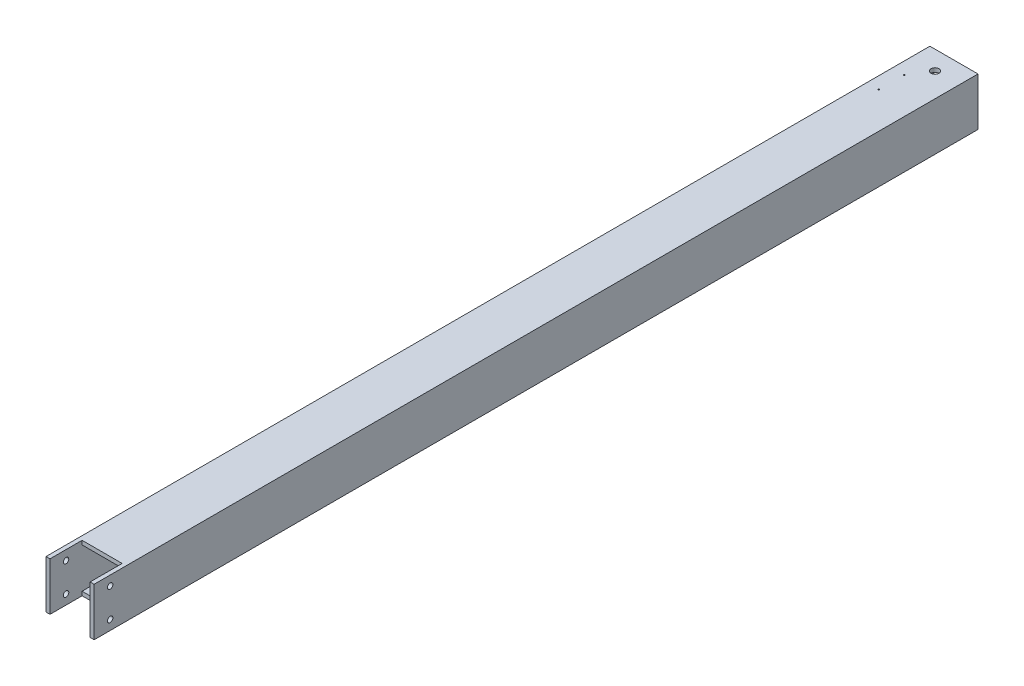
ISO-10303-21;
HEADER;
FILE_DESCRIPTION(('STEP AP214'),'2;1');
FILE_NAME('part.step','',(''),(''),'','','');
FILE_SCHEMA(('AUTOMOTIVE_DESIGN { 1 0 10303 214 1 1 1 1 }'));
ENDSEC;
DATA;
#1=APPLICATION_CONTEXT('core data for automotive mechanical design processes');
#2=APPLICATION_PROTOCOL_DEFINITION('international standard','automotive_design',2000,#1);
#3=PRODUCT_CONTEXT('',#1,'mechanical');
#4=PRODUCT('Part','Part','',(#3));
#5=PRODUCT_RELATED_PRODUCT_CATEGORY('part','',(#4));
#6=PRODUCT_DEFINITION_FORMATION('','',#4);
#7=PRODUCT_DEFINITION_CONTEXT('part definition',#1,'design');
#8=PRODUCT_DEFINITION('design','',#6,#7);
#9=PRODUCT_DEFINITION_SHAPE('','',#8);
#10=(LENGTH_UNIT() NAMED_UNIT(*) SI_UNIT(.MILLI.,.METRE.));
#11=(NAMED_UNIT(*) PLANE_ANGLE_UNIT() SI_UNIT($,.RADIAN.));
#12=(NAMED_UNIT(*) SI_UNIT($,.STERADIAN.) SOLID_ANGLE_UNIT());
#13=UNCERTAINTY_MEASURE_WITH_UNIT(LENGTH_MEASURE(1.E-05),#10,'distance_accuracy_value','');
#14=(GEOMETRIC_REPRESENTATION_CONTEXT(3) GLOBAL_UNCERTAINTY_ASSIGNED_CONTEXT((#13)) GLOBAL_UNIT_ASSIGNED_CONTEXT((#10,
#11,#12)) REPRESENTATION_CONTEXT('',''));
#15=CARTESIAN_POINT('',(0.,0.,0.));
#16=DIRECTION('',(0.,0.,1.));
#17=DIRECTION('',(1.,0.,0.));
#18=AXIS2_PLACEMENT_3D('',#15,#16,#17);
#19=CARTESIAN_POINT('',(0.,0.,350.));
#20=DIRECTION('',(0.,0.,1.));
#21=DIRECTION('',(1.,0.,0.));
#22=AXIS2_PLACEMENT_3D('',#19,#20,#21);
#23=PLANE('',#22);
#24=DIRECTION('',(0.,1.,0.));
#25=VECTOR('',#24,1.);
#26=CARTESIAN_POINT('',(15.875,15.875,350.));
#27=LINE('',#26,#25);
#28=CARTESIAN_POINT('',(15.875,-19.05,350.));
#29=VERTEX_POINT('',#28);
#30=CARTESIAN_POINT('',(15.875,19.05,350.));
#31=VERTEX_POINT('',#30);
#32=EDGE_CURVE('E135',#29,#31,#27,.T.);
#33=ORIENTED_EDGE('',*,*,#32,.F.);
#34=DIRECTION('',(1.,0.,0.));
#35=VECTOR('',#34,1.);
#36=CARTESIAN_POINT('',(-19.05,-19.05,350.));
#37=LINE('',#36,#35);
#38=CARTESIAN_POINT('',(19.05,-19.05,350.));
#39=VERTEX_POINT('',#38);
#40=EDGE_CURVE('E172',#29,#39,#37,.T.);
#41=ORIENTED_EDGE('',*,*,#40,.T.);
#42=DIRECTION('',(0.,1.,0.));
#43=VECTOR('',#42,1.);
#44=CARTESIAN_POINT('',(19.05,19.05,350.));
#45=LINE('',#44,#43);
#46=CARTESIAN_POINT('',(19.05,19.05,350.));
#47=VERTEX_POINT('',#46);
#48=EDGE_CURVE('E164',#39,#47,#45,.T.);
#49=ORIENTED_EDGE('',*,*,#48,.T.);
#50=DIRECTION('',(-1.,0.,0.));
#51=VECTOR('',#50,1.);
#52=CARTESIAN_POINT('',(-19.05,19.05,350.));
#53=LINE('',#52,#51);
#54=EDGE_CURVE('E154',#47,#31,#53,.T.);
#55=ORIENTED_EDGE('',*,*,#54,.T.);
#56=EDGE_LOOP('',(#33,#41,#49,#55));
#57=FACE_BOUND('',#56,.T.);
#58=ADVANCED_FACE('F42',(#57),#23,.T.);
#59=DIRECTION('',(0.,-1.,0.));
#60=VECTOR('',#59,1.);
#61=CARTESIAN_POINT('',(-15.875,15.875,350.));
#62=LINE('',#61,#60);
#63=CARTESIAN_POINT('',(-15.875,19.05,350.));
#64=VERTEX_POINT('',#63);
#65=CARTESIAN_POINT('',(-15.875,-19.05,350.));
#66=VERTEX_POINT('',#65);
#67=EDGE_CURVE('E148',#64,#66,#62,.T.);
#68=ORIENTED_EDGE('',*,*,#67,.F.);
#69=CARTESIAN_POINT('',(-19.05,19.05,350.));
#70=VERTEX_POINT('',#69);
#71=EDGE_CURVE('E168',#64,#70,#53,.T.);
#72=ORIENTED_EDGE('',*,*,#71,.T.);
#73=DIRECTION('',(0.,-1.,0.));
#74=VECTOR('',#73,1.);
#75=CARTESIAN_POINT('',(-19.05,19.05,350.));
#76=LINE('',#75,#74);
#77=CARTESIAN_POINT('',(-19.05,-19.05,350.));
#78=VERTEX_POINT('',#77);
#79=EDGE_CURVE('E167',#70,#78,#76,.T.);
#80=ORIENTED_EDGE('',*,*,#79,.T.);
#81=EDGE_CURVE('E177',#78,#66,#37,.T.);
#82=ORIENTED_EDGE('',*,*,#81,.T.);
#83=EDGE_LOOP('',(#68,#72,#80,#82));
#84=FACE_BOUND('',#83,.T.);
#85=ADVANCED_FACE('F357',(#84),#23,.T.);
#86=CARTESIAN_POINT('',(0.,0.,-350.));
#87=DIRECTION('',(0.,0.,1.));
#88=DIRECTION('',(1.,0.,0.));
#89=AXIS2_PLACEMENT_3D('',#86,#87,#88);
#90=PLANE('',#89);
#91=DIRECTION('',(0.,1.,0.));
#92=VECTOR('',#91,1.);
#93=CARTESIAN_POINT('',(19.05,19.05,-350.));
#94=LINE('',#93,#92);
#95=CARTESIAN_POINT('',(19.05,-19.05,-350.));
#96=VERTEX_POINT('',#95);
#97=CARTESIAN_POINT('',(19.05,19.05,-350.));
#98=VERTEX_POINT('',#97);
#99=EDGE_CURVE('E182',#96,#98,#94,.T.);
#100=ORIENTED_EDGE('',*,*,#99,.F.);
#101=DIRECTION('',(1.,0.,0.));
#102=VECTOR('',#101,1.);
#103=CARTESIAN_POINT('',(-19.05,-19.05,-350.));
#104=LINE('',#103,#102);
#105=CARTESIAN_POINT('',(-19.05,-19.05,-350.));
#106=VERTEX_POINT('',#105);
#107=EDGE_CURVE('E193',#106,#96,#104,.T.);
#108=ORIENTED_EDGE('',*,*,#107,.F.);
#109=DIRECTION('',(0.,-1.,0.));
#110=VECTOR('',#109,1.);
#111=CARTESIAN_POINT('',(-19.05,19.05,-350.));
#112=LINE('',#111,#110);
#113=CARTESIAN_POINT('',(-19.05,19.05,-350.));
#114=VERTEX_POINT('',#113);
#115=EDGE_CURVE('E190',#114,#106,#112,.T.);
#116=ORIENTED_EDGE('',*,*,#115,.F.);
#117=DIRECTION('',(-1.,0.,0.));
#118=VECTOR('',#117,1.);
#119=CARTESIAN_POINT('',(-19.05,19.05,-350.));
#120=LINE('',#119,#118);
#121=EDGE_CURVE('E186',#98,#114,#120,.T.);
#122=ORIENTED_EDGE('',*,*,#121,.F.);
#123=EDGE_LOOP('',(#100,#108,#116,#122));
#124=FACE_BOUND('',#123,.T.);
#125=DIRECTION('',(0.,1.,0.));
#126=VECTOR('',#125,1.);
#127=CARTESIAN_POINT('',(15.875,15.875,-350.));
#128=LINE('',#127,#126);
#129=CARTESIAN_POINT('',(15.875,-15.875,-350.));
#130=VERTEX_POINT('',#129);
#131=CARTESIAN_POINT('',(15.875,15.875,-350.));
#132=VERTEX_POINT('',#131);
#133=EDGE_CURVE('E311',#130,#132,#128,.T.);
#134=ORIENTED_EDGE('',*,*,#133,.T.);
#135=DIRECTION('',(-1.,0.,0.));
#136=VECTOR('',#135,1.);
#137=CARTESIAN_POINT('',(-15.875,15.875,-350.));
#138=LINE('',#137,#136);
#139=CARTESIAN_POINT('',(-15.875,15.875,-350.));
#140=VERTEX_POINT('',#139);
#141=EDGE_CURVE('E318',#132,#140,#138,.T.);
#142=ORIENTED_EDGE('',*,*,#141,.T.);
#143=DIRECTION('',(0.,-1.,0.));
#144=VECTOR('',#143,1.);
#145=CARTESIAN_POINT('',(-15.875,15.875,-350.));
#146=LINE('',#145,#144);
#147=CARTESIAN_POINT('',(-15.875,-15.875,-350.));
#148=VERTEX_POINT('',#147);
#149=EDGE_CURVE('E322',#140,#148,#146,.T.);
#150=ORIENTED_EDGE('',*,*,#149,.T.);
#151=DIRECTION('',(1.,0.,0.));
#152=VECTOR('',#151,1.);
#153=CARTESIAN_POINT('',(-15.875,-15.875,-350.));
#154=LINE('',#153,#152);
#155=EDGE_CURVE('E149',#148,#130,#154,.T.);
#156=ORIENTED_EDGE('',*,*,#155,.T.);
#157=EDGE_LOOP('',(#134,#142,#150,#156));
#158=FACE_BOUND('',#157,.T.);
#159=ADVANCED_FACE('F345',(#124,#158),#90,.F.);
#160=CARTESIAN_POINT('',(19.05,19.05,350.));
#161=DIRECTION('',(-1.,0.,0.));
#162=DIRECTION('',(0.,0.,1.));
#163=AXIS2_PLACEMENT_3D('',#160,#161,#162);
#164=PLANE('',#163);
#165=CARTESIAN_POINT('',(19.05,11.43,337.3));
#166=DIRECTION('',(1.,0.,0.));
#167=DIRECTION('',(0.,0.,1.));
#168=AXIS2_PLACEMENT_3D('',#165,#166,#167);
#169=CIRCLE('',#168,2.15900000000002);
#170=CARTESIAN_POINT('',(19.05,11.43,339.459));
#171=VERTEX_POINT('',#170);
#172=EDGE_CURVE('E219',#171,#171,#169,.T.);
#173=ORIENTED_EDGE('',*,*,#172,.F.);
#174=EDGE_LOOP('',(#173));
#175=FACE_BOUND('',#174,.T.);
#176=CARTESIAN_POINT('',(19.05,-11.43,337.3));
#177=DIRECTION('',(-1.,0.,0.));
#178=DIRECTION('',(0.,0.,1.));
#179=AXIS2_PLACEMENT_3D('',#176,#177,#178);
#180=CIRCLE('',#179,2.15900000000002);
#181=CARTESIAN_POINT('',(19.05,-11.43,339.459));
#182=VERTEX_POINT('',#181);
#183=EDGE_CURVE('E214',#182,#182,#180,.T.);
#184=ORIENTED_EDGE('',*,*,#183,.T.);
#185=EDGE_LOOP('',(#184));
#186=FACE_BOUND('',#185,.T.);
#187=ORIENTED_EDGE('',*,*,#99,.T.);
#188=DIRECTION('',(0.,0.,-1.));
#189=VECTOR('',#188,1.);
#190=CARTESIAN_POINT('',(19.05,19.05,350.));
#191=LINE('',#190,#189);
#192=EDGE_CURVE('E52',#47,#98,#191,.T.);
#193=ORIENTED_EDGE('',*,*,#192,.F.);
#194=ORIENTED_EDGE('',*,*,#48,.F.);
#195=DIRECTION('',(0.,0.,-1.));
#196=VECTOR('',#195,1.);
#197=CARTESIAN_POINT('',(19.05,-19.05,350.));
#198=LINE('',#197,#196);
#199=EDGE_CURVE('E181',#39,#96,#198,.T.);
#200=ORIENTED_EDGE('',*,*,#199,.T.);
#201=EDGE_LOOP('',(#187,#193,#194,#200));
#202=FACE_BOUND('',#201,.T.);
#203=ADVANCED_FACE('F44',(#175,#186,#202),#164,.F.);
#204=CARTESIAN_POINT('',(-19.05,19.05,350.));
#205=DIRECTION('',(0.,-1.,0.));
#206=DIRECTION('',(0.,0.,-1.));
#207=AXIS2_PLACEMENT_3D('',#204,#205,#206);
#208=PLANE('',#207);
#209=CARTESIAN_POINT('',(-9.525,19.05,-320.));
#210=DIRECTION('',(0.,1.,0.));
#211=DIRECTION('',(0.,0.,1.));
#212=AXIS2_PLACEMENT_3D('',#209,#210,#211);
#213=CIRCLE('',#212,0.500000000000001);
#214=CARTESIAN_POINT('',(-9.525,19.05,-319.5));
#215=VERTEX_POINT('',#214);
#216=EDGE_CURVE('E239',#215,#215,#213,.T.);
#217=ORIENTED_EDGE('',*,*,#216,.F.);
#218=EDGE_LOOP('',(#217));
#219=FACE_BOUND('',#218,.T.);
#220=CARTESIAN_POINT('',(-9.525,19.05,-300.));
#221=DIRECTION('',(0.,1.,0.));
#222=DIRECTION('',(0.,0.,1.));
#223=AXIS2_PLACEMENT_3D('',#220,#221,#222);
#224=CIRCLE('',#223,0.500000000000001);
#225=CARTESIAN_POINT('',(-9.525,19.05,-299.5));
#226=VERTEX_POINT('',#225);
#227=EDGE_CURVE('E247',#226,#226,#224,.T.);
#228=ORIENTED_EDGE('',*,*,#227,.F.);
#229=EDGE_LOOP('',(#228));
#230=FACE_BOUND('',#229,.T.);
#231=CARTESIAN_POINT('',(0.,19.05,-335.));
#232=DIRECTION('',(0.,-1.,0.));
#233=DIRECTION('',(0.,0.,-1.));
#234=AXIS2_PLACEMENT_3D('',#231,#232,#233);
#235=CIRCLE('',#234,3.175);
#236=CARTESIAN_POINT('',(0.,19.05,-338.175));
#237=VERTEX_POINT('',#236);
#238=EDGE_CURVE('E226',#237,#237,#235,.T.);
#239=ORIENTED_EDGE('',*,*,#238,.T.);
#240=EDGE_LOOP('',(#239));
#241=FACE_BOUND('',#240,.T.);
#242=DIRECTION('',(1.,0.,0.));
#243=VECTOR('',#242,1.);
#244=CARTESIAN_POINT('',(15.875,19.05,324.6));
#245=LINE('',#244,#243);
#246=CARTESIAN_POINT('',(-15.875,19.05,324.6));
#247=VERTEX_POINT('',#246);
#248=CARTESIAN_POINT('',(15.875,19.05,324.6));
#249=VERTEX_POINT('',#248);
#250=EDGE_CURVE('E158',#247,#249,#245,.T.);
#251=ORIENTED_EDGE('',*,*,#250,.T.);
#252=DIRECTION('',(0.,0.,1.));
#253=VECTOR('',#252,1.);
#254=CARTESIAN_POINT('',(15.875,19.05,350.));
#255=LINE('',#254,#253);
#256=EDGE_CURVE('E140',#249,#31,#255,.T.);
#257=ORIENTED_EDGE('',*,*,#256,.T.);
#258=ORIENTED_EDGE('',*,*,#54,.F.);
#259=ORIENTED_EDGE('',*,*,#192,.T.);
#260=ORIENTED_EDGE('',*,*,#121,.T.);
#261=DIRECTION('',(0.,0.,-1.));
#262=VECTOR('',#261,1.);
#263=CARTESIAN_POINT('',(-19.05,19.05,350.));
#264=LINE('',#263,#262);
#265=EDGE_CURVE('E203',#70,#114,#264,.T.);
#266=ORIENTED_EDGE('',*,*,#265,.F.);
#267=ORIENTED_EDGE('',*,*,#71,.F.);
#268=DIRECTION('',(0.,0.,-1.));
#269=VECTOR('',#268,1.);
#270=CARTESIAN_POINT('',(-15.875,19.05,350.));
#271=LINE('',#270,#269);
#272=EDGE_CURVE('E160',#64,#247,#271,.T.);
#273=ORIENTED_EDGE('',*,*,#272,.T.);
#274=EDGE_LOOP('',(#251,#257,#258,#259,#260,#266,#267,#273));
#275=FACE_BOUND('',#274,.T.);
#276=ADVANCED_FACE('F152',(#219,#230,#241,#275),#208,.F.);
#277=CARTESIAN_POINT('',(-19.05,19.05,350.));
#278=DIRECTION('',(1.,0.,0.));
#279=DIRECTION('',(0.,0.,-1.));
#280=AXIS2_PLACEMENT_3D('',#277,#278,#279);
#281=PLANE('',#280);
#282=CARTESIAN_POINT('',(-19.05,11.43,337.3));
#283=DIRECTION('',(1.,0.,0.));
#284=DIRECTION('',(0.,0.,1.));
#285=AXIS2_PLACEMENT_3D('',#282,#283,#284);
#286=CIRCLE('',#285,2.15900000000002);
#287=CARTESIAN_POINT('',(-19.05,11.43,339.459));
#288=VERTEX_POINT('',#287);
#289=EDGE_CURVE('E292',#288,#288,#286,.T.);
#290=ORIENTED_EDGE('',*,*,#289,.T.);
#291=EDGE_LOOP('',(#290));
#292=FACE_BOUND('',#291,.T.);
#293=CARTESIAN_POINT('',(-19.05,-11.43,337.3));
#294=DIRECTION('',(-1.,0.,0.));
#295=DIRECTION('',(0.,0.,1.));
#296=AXIS2_PLACEMENT_3D('',#293,#294,#295);
#297=CIRCLE('',#296,2.15900000000002);
#298=CARTESIAN_POINT('',(-19.05,-11.43,339.459));
#299=VERTEX_POINT('',#298);
#300=EDGE_CURVE('E302',#299,#299,#297,.T.);
#301=ORIENTED_EDGE('',*,*,#300,.F.);
#302=EDGE_LOOP('',(#301));
#303=FACE_BOUND('',#302,.T.);
#304=ORIENTED_EDGE('',*,*,#115,.T.);
#305=DIRECTION('',(0.,0.,-1.));
#306=VECTOR('',#305,1.);
#307=CARTESIAN_POINT('',(-19.05,-19.05,350.));
#308=LINE('',#307,#306);
#309=EDGE_CURVE('E199',#78,#106,#308,.T.);
#310=ORIENTED_EDGE('',*,*,#309,.F.);
#311=ORIENTED_EDGE('',*,*,#79,.F.);
#312=ORIENTED_EDGE('',*,*,#265,.T.);
#313=EDGE_LOOP('',(#304,#310,#311,#312));
#314=FACE_BOUND('',#313,.T.);
#315=ADVANCED_FACE('F393',(#292,#303,#314),#281,.F.);
#316=CARTESIAN_POINT('',(-19.05,-19.05,350.));
#317=DIRECTION('',(0.,1.,0.));
#318=DIRECTION('',(0.,0.,1.));
#319=AXIS2_PLACEMENT_3D('',#316,#317,#318);
#320=PLANE('',#319);
#321=CARTESIAN_POINT('',(9.525,-19.05,-320.));
#322=DIRECTION('',(0.,1.,0.));
#323=DIRECTION('',(0.,0.,1.));
#324=AXIS2_PLACEMENT_3D('',#321,#322,#323);
#325=CIRCLE('',#324,0.500000000000001);
#326=CARTESIAN_POINT('',(9.525,-19.05,-319.5));
#327=VERTEX_POINT('',#326);
#328=EDGE_CURVE('E232',#327,#327,#325,.T.);
#329=ORIENTED_EDGE('',*,*,#328,.T.);
#330=EDGE_LOOP('',(#329));
#331=FACE_BOUND('',#330,.T.);
#332=CARTESIAN_POINT('',(9.525,-19.05,-300.));
#333=DIRECTION('',(0.,1.,0.));
#334=DIRECTION('',(0.,0.,1.));
#335=AXIS2_PLACEMENT_3D('',#332,#333,#334);
#336=CIRCLE('',#335,0.500000000000001);
#337=CARTESIAN_POINT('',(9.525,-19.05,-299.5));
#338=VERTEX_POINT('',#337);
#339=EDGE_CURVE('E245',#338,#338,#336,.T.);
#340=ORIENTED_EDGE('',*,*,#339,.T.);
#341=EDGE_LOOP('',(#340));
#342=FACE_BOUND('',#341,.T.);
#343=CARTESIAN_POINT('',(0.,-19.05,-335.));
#344=DIRECTION('',(0.,-1.,0.));
#345=DIRECTION('',(0.,0.,-1.));
#346=AXIS2_PLACEMENT_3D('',#343,#344,#345);
#347=CIRCLE('',#346,3.175);
#348=CARTESIAN_POINT('',(0.,-19.05,-338.175));
#349=VERTEX_POINT('',#348);
#350=EDGE_CURVE('E235',#349,#349,#347,.T.);
#351=ORIENTED_EDGE('',*,*,#350,.F.);
#352=EDGE_LOOP('',(#351));
#353=FACE_BOUND('',#352,.T.);
#354=ORIENTED_EDGE('',*,*,#40,.F.);
#355=DIRECTION('',(0.,0.,1.));
#356=VECTOR('',#355,1.);
#357=CARTESIAN_POINT('',(15.875,-19.05,350.));
#358=LINE('',#357,#356);
#359=CARTESIAN_POINT('',(15.875,-19.05,324.6));
#360=VERTEX_POINT('',#359);
#361=EDGE_CURVE('E143',#360,#29,#358,.T.);
#362=ORIENTED_EDGE('',*,*,#361,.F.);
#363=DIRECTION('',(1.,0.,0.));
#364=VECTOR('',#363,1.);
#365=CARTESIAN_POINT('',(15.875,-19.05,324.6));
#366=LINE('',#365,#364);
#367=CARTESIAN_POINT('',(-15.875,-19.05,324.6));
#368=VERTEX_POINT('',#367);
#369=EDGE_CURVE('E161',#368,#360,#366,.T.);
#370=ORIENTED_EDGE('',*,*,#369,.F.);
#371=DIRECTION('',(0.,0.,-1.));
#372=VECTOR('',#371,1.);
#373=CARTESIAN_POINT('',(-15.875,-19.05,350.));
#374=LINE('',#373,#372);
#375=EDGE_CURVE('E276',#66,#368,#374,.T.);
#376=ORIENTED_EDGE('',*,*,#375,.F.);
#377=ORIENTED_EDGE('',*,*,#81,.F.);
#378=ORIENTED_EDGE('',*,*,#309,.T.);
#379=ORIENTED_EDGE('',*,*,#107,.T.);
#380=ORIENTED_EDGE('',*,*,#199,.F.);
#381=EDGE_LOOP('',(#354,#362,#370,#376,#377,#378,#379,#380));
#382=FACE_BOUND('',#381,.T.);
#383=ADVANCED_FACE('F363',(#331,#342,#353,#382),#320,.F.);
#384=CARTESIAN_POINT('',(15.875,15.875,350.));
#385=DIRECTION('',(-1.,0.,0.));
#386=DIRECTION('',(0.,0.,1.));
#387=AXIS2_PLACEMENT_3D('',#384,#385,#386);
#388=PLANE('',#387);
#389=DIRECTION('',(0.,0.,-1.));
#390=VECTOR('',#389,1.);
#391=CARTESIAN_POINT('',(15.875,-15.875,350.));
#392=LINE('',#391,#390);
#393=CARTESIAN_POINT('',(15.875,-15.875,324.6));
#394=VERTEX_POINT('',#393);
#395=EDGE_CURVE('E67',#394,#130,#392,.T.);
#396=ORIENTED_EDGE('',*,*,#395,.F.);
#397=DIRECTION('',(0.,-1.,0.));
#398=VECTOR('',#397,1.);
#399=CARTESIAN_POINT('',(15.875,19.05,324.6));
#400=LINE('',#399,#398);
#401=EDGE_CURVE('E286',#394,#360,#400,.T.);
#402=ORIENTED_EDGE('',*,*,#401,.T.);
#403=ORIENTED_EDGE('',*,*,#361,.T.);
#404=ORIENTED_EDGE('',*,*,#32,.T.);
#405=ORIENTED_EDGE('',*,*,#256,.F.);
#406=CARTESIAN_POINT('',(15.875,15.875,324.6));
#407=VERTEX_POINT('',#406);
#408=EDGE_CURVE('E282',#249,#407,#400,.T.);
#409=ORIENTED_EDGE('',*,*,#408,.T.);
#410=DIRECTION('',(0.,0.,-1.));
#411=VECTOR('',#410,1.);
#412=CARTESIAN_POINT('',(15.875,15.875,350.));
#413=LINE('',#412,#411);
#414=EDGE_CURVE('E187',#407,#132,#413,.T.);
#415=ORIENTED_EDGE('',*,*,#414,.T.);
#416=ORIENTED_EDGE('',*,*,#133,.F.);
#417=EDGE_LOOP('',(#396,#402,#403,#404,#405,#409,#415,#416));
#418=FACE_BOUND('',#417,.T.);
#419=CARTESIAN_POINT('',(15.875,11.43,337.3));
#420=DIRECTION('',(-1.,0.,0.));
#421=DIRECTION('',(0.,0.,1.));
#422=AXIS2_PLACEMENT_3D('',#419,#420,#421);
#423=CIRCLE('',#422,2.15900000000002);
#424=CARTESIAN_POINT('',(15.875,11.43,339.459));
#425=VERTEX_POINT('',#424);
#426=EDGE_CURVE('E218',#425,#425,#423,.F.);
#427=ORIENTED_EDGE('',*,*,#426,.T.);
#428=EDGE_LOOP('',(#427));
#429=FACE_BOUND('',#428,.T.);
#430=CARTESIAN_POINT('',(15.875,-11.43,337.3));
#431=DIRECTION('',(-1.,0.,0.));
#432=DIRECTION('',(0.,0.,1.));
#433=AXIS2_PLACEMENT_3D('',#430,#431,#432);
#434=CIRCLE('',#433,2.15900000000002);
#435=CARTESIAN_POINT('',(15.875,-11.43,339.459));
#436=VERTEX_POINT('',#435);
#437=EDGE_CURVE('E213',#436,#436,#434,.T.);
#438=ORIENTED_EDGE('',*,*,#437,.F.);
#439=EDGE_LOOP('',(#438));
#440=FACE_BOUND('',#439,.T.);
#441=ADVANCED_FACE('F137',(#418,#429,#440),#388,.T.);
#442=CARTESIAN_POINT('',(-15.875,15.875,350.));
#443=DIRECTION('',(0.,-1.,0.));
#444=DIRECTION('',(0.,0.,-1.));
#445=AXIS2_PLACEMENT_3D('',#442,#443,#444);
#446=PLANE('',#445);
#447=CARTESIAN_POINT('',(-9.525,15.875,-320.));
#448=DIRECTION('',(0.,-1.,0.));
#449=DIRECTION('',(0.,0.,-1.));
#450=AXIS2_PLACEMENT_3D('',#447,#448,#449);
#451=CIRCLE('',#450,0.500000000000001);
#452=CARTESIAN_POINT('',(-9.525,15.875,-320.5));
#453=VERTEX_POINT('',#452);
#454=EDGE_CURVE('E46',#453,#453,#451,.F.);
#455=ORIENTED_EDGE('',*,*,#454,.T.);
#456=EDGE_LOOP('',(#455));
#457=FACE_BOUND('',#456,.T.);
#458=CARTESIAN_POINT('',(-9.525,15.875,-300.));
#459=DIRECTION('',(0.,-1.,0.));
#460=DIRECTION('',(0.,0.,-1.));
#461=AXIS2_PLACEMENT_3D('',#458,#459,#460);
#462=CIRCLE('',#461,0.500000000000001);
#463=CARTESIAN_POINT('',(-9.525,15.875,-300.5));
#464=VERTEX_POINT('',#463);
#465=EDGE_CURVE('E236',#464,#464,#462,.F.);
#466=ORIENTED_EDGE('',*,*,#465,.T.);
#467=EDGE_LOOP('',(#466));
#468=FACE_BOUND('',#467,.T.);
#469=CARTESIAN_POINT('',(0.,15.875,-335.));
#470=DIRECTION('',(0.,-1.,0.));
#471=DIRECTION('',(0.,0.,-1.));
#472=AXIS2_PLACEMENT_3D('',#469,#470,#471);
#473=CIRCLE('',#472,3.175);
#474=CARTESIAN_POINT('',(0.,15.875,-338.175));
#475=VERTEX_POINT('',#474);
#476=EDGE_CURVE('E225',#475,#475,#473,.T.);
#477=ORIENTED_EDGE('',*,*,#476,.F.);
#478=EDGE_LOOP('',(#477));
#479=FACE_BOUND('',#478,.T.);
#480=DIRECTION('',(1.,0.,0.));
#481=VECTOR('',#480,1.);
#482=CARTESIAN_POINT('',(-15.875,15.875,324.6));
#483=LINE('',#482,#481);
#484=CARTESIAN_POINT('',(-15.875,15.875,324.6));
#485=VERTEX_POINT('',#484);
#486=EDGE_CURVE('E285',#485,#407,#483,.T.);
#487=ORIENTED_EDGE('',*,*,#486,.F.);
#488=DIRECTION('',(0.,0.,-1.));
#489=VECTOR('',#488,1.);
#490=CARTESIAN_POINT('',(-15.875,15.875,350.));
#491=LINE('',#490,#489);
#492=EDGE_CURVE('E334',#485,#140,#491,.T.);
#493=ORIENTED_EDGE('',*,*,#492,.T.);
#494=ORIENTED_EDGE('',*,*,#141,.F.);
#495=ORIENTED_EDGE('',*,*,#414,.F.);
#496=EDGE_LOOP('',(#487,#493,#494,#495));
#497=FACE_BOUND('',#496,.T.);
#498=ADVANCED_FACE('F341',(#457,#468,#479,#497),#446,.T.);
#499=CARTESIAN_POINT('',(-15.875,15.875,350.));
#500=DIRECTION('',(1.,0.,0.));
#501=DIRECTION('',(0.,0.,-1.));
#502=AXIS2_PLACEMENT_3D('',#499,#500,#501);
#503=PLANE('',#502);
#504=ORIENTED_EDGE('',*,*,#492,.F.);
#505=DIRECTION('',(0.,-1.,0.));
#506=VECTOR('',#505,1.);
#507=CARTESIAN_POINT('',(-15.875,19.05,324.6));
#508=LINE('',#507,#506);
#509=EDGE_CURVE('E287',#247,#485,#508,.T.);
#510=ORIENTED_EDGE('',*,*,#509,.F.);
#511=ORIENTED_EDGE('',*,*,#272,.F.);
#512=ORIENTED_EDGE('',*,*,#67,.T.);
#513=ORIENTED_EDGE('',*,*,#375,.T.);
#514=CARTESIAN_POINT('',(-15.875,-15.875,324.6));
#515=VERTEX_POINT('',#514);
#516=EDGE_CURVE('E60',#515,#368,#508,.T.);
#517=ORIENTED_EDGE('',*,*,#516,.F.);
#518=DIRECTION('',(0.,0.,-1.));
#519=VECTOR('',#518,1.);
#520=CARTESIAN_POINT('',(-15.875,-15.875,350.));
#521=LINE('',#520,#519);
#522=EDGE_CURVE('E331',#515,#148,#521,.T.);
#523=ORIENTED_EDGE('',*,*,#522,.T.);
#524=ORIENTED_EDGE('',*,*,#149,.F.);
#525=EDGE_LOOP('',(#504,#510,#511,#512,#513,#517,#523,#524));
#526=FACE_BOUND('',#525,.T.);
#527=CARTESIAN_POINT('',(-15.875,11.43,337.3));
#528=DIRECTION('',(1.,0.,0.));
#529=DIRECTION('',(0.,0.,-1.));
#530=AXIS2_PLACEMENT_3D('',#527,#528,#529);
#531=CIRCLE('',#530,2.15900000000002);
#532=CARTESIAN_POINT('',(-15.875,11.43,339.459));
#533=VERTEX_POINT('',#532);
#534=EDGE_CURVE('E215',#533,#533,#531,.F.);
#535=ORIENTED_EDGE('',*,*,#534,.T.);
#536=EDGE_LOOP('',(#535));
#537=FACE_BOUND('',#536,.T.);
#538=CARTESIAN_POINT('',(-15.875,-11.43,337.3));
#539=DIRECTION('',(1.,0.,0.));
#540=DIRECTION('',(0.,0.,-1.));
#541=AXIS2_PLACEMENT_3D('',#538,#539,#540);
#542=CIRCLE('',#541,2.15900000000002);
#543=CARTESIAN_POINT('',(-15.875,-11.43,339.459));
#544=VERTEX_POINT('',#543);
#545=EDGE_CURVE('E209',#544,#544,#542,.T.);
#546=ORIENTED_EDGE('',*,*,#545,.F.);
#547=EDGE_LOOP('',(#546));
#548=FACE_BOUND('',#547,.T.);
#549=ADVANCED_FACE('F348',(#526,#537,#548),#503,.T.);
#550=CARTESIAN_POINT('',(-15.875,-15.875,350.));
#551=DIRECTION('',(0.,1.,0.));
#552=DIRECTION('',(0.,0.,1.));
#553=AXIS2_PLACEMENT_3D('',#550,#551,#552);
#554=PLANE('',#553);
#555=CARTESIAN_POINT('',(9.525,-15.875,-320.));
#556=DIRECTION('',(0.,1.,0.));
#557=DIRECTION('',(0.,0.,1.));
#558=AXIS2_PLACEMENT_3D('',#555,#556,#557);
#559=CIRCLE('',#558,0.500000000000001);
#560=CARTESIAN_POINT('',(9.525,-15.875,-319.5));
#561=VERTEX_POINT('',#560);
#562=EDGE_CURVE('E231',#561,#561,#559,.T.);
#563=ORIENTED_EDGE('',*,*,#562,.F.);
#564=EDGE_LOOP('',(#563));
#565=FACE_BOUND('',#564,.T.);
#566=CARTESIAN_POINT('',(9.525,-15.875,-300.));
#567=DIRECTION('',(0.,1.,0.));
#568=DIRECTION('',(0.,0.,1.));
#569=AXIS2_PLACEMENT_3D('',#566,#567,#568);
#570=CIRCLE('',#569,0.500000000000001);
#571=CARTESIAN_POINT('',(9.525,-15.875,-299.5));
#572=VERTEX_POINT('',#571);
#573=EDGE_CURVE('E227',#572,#572,#570,.T.);
#574=ORIENTED_EDGE('',*,*,#573,.F.);
#575=EDGE_LOOP('',(#574));
#576=FACE_BOUND('',#575,.T.);
#577=CARTESIAN_POINT('',(0.,-15.875,-335.));
#578=DIRECTION('',(0.,1.,0.));
#579=DIRECTION('',(0.,0.,1.));
#580=AXIS2_PLACEMENT_3D('',#577,#578,#579);
#581=CIRCLE('',#580,3.175);
#582=CARTESIAN_POINT('',(0.,-15.875,-331.825));
#583=VERTEX_POINT('',#582);
#584=EDGE_CURVE('E221',#583,#583,#581,.T.);
#585=ORIENTED_EDGE('',*,*,#584,.F.);
#586=EDGE_LOOP('',(#585));
#587=FACE_BOUND('',#586,.T.);
#588=DIRECTION('',(-1.,0.,0.));
#589=VECTOR('',#588,1.);
#590=CARTESIAN_POINT('',(-15.875,-15.875,324.6));
#591=LINE('',#590,#589);
#592=EDGE_CURVE('E11',#394,#515,#591,.T.);
#593=ORIENTED_EDGE('',*,*,#592,.F.);
#594=ORIENTED_EDGE('',*,*,#395,.T.);
#595=ORIENTED_EDGE('',*,*,#155,.F.);
#596=ORIENTED_EDGE('',*,*,#522,.F.);
#597=EDGE_LOOP('',(#593,#594,#595,#596));
#598=FACE_BOUND('',#597,.T.);
#599=ADVANCED_FACE('F347',(#565,#576,#587,#598),#554,.T.);
#600=CARTESIAN_POINT('',(19.05,-11.43,337.3));
#601=DIRECTION('',(-1.,0.,0.));
#602=DIRECTION('',(0.,0.,1.));
#603=AXIS2_PLACEMENT_3D('',#600,#601,#602);
#604=CYLINDRICAL_SURFACE('',#603,2.15900000000002);
#605=CARTESIAN_POINT('',(-15.875,-11.43,339.459));
#606=CARTESIAN_POINT('',(-15.9080729166667,-11.43,339.459));
#607=CARTESIAN_POINT('',(-15.9411458333333,-11.43,339.459));
#608=CARTESIAN_POINT('',(-16.0072916666667,-11.43,339.459));
#609=CARTESIAN_POINT('',(-16.0403645833333,-11.43,339.459));
#610=CARTESIAN_POINT('',(-16.1065104166667,-11.43,339.459));
#611=CARTESIAN_POINT('',(-16.1395833333333,-11.43,339.459));
#612=CARTESIAN_POINT('',(-16.2057291666667,-11.43,339.459));
#613=CARTESIAN_POINT('',(-16.2388020833333,-11.43,339.459));
#614=CARTESIAN_POINT('',(-16.3049479166667,-11.43,339.459));
#615=CARTESIAN_POINT('',(-16.3380208333333,-11.43,339.459));
#616=CARTESIAN_POINT('',(-16.4041666666667,-11.43,339.459));
#617=CARTESIAN_POINT('',(-16.4372395833333,-11.43,339.459));
#618=CARTESIAN_POINT('',(-16.5033854166667,-11.43,339.459));
#619=CARTESIAN_POINT('',(-16.5364583333333,-11.43,339.459));
#620=CARTESIAN_POINT('',(-16.6026041666667,-11.43,339.459));
#621=CARTESIAN_POINT('',(-16.6356770833333,-11.43,339.459));
#622=CARTESIAN_POINT('',(-16.7018229166667,-11.43,339.459));
#623=CARTESIAN_POINT('',(-16.7348958333333,-11.43,339.459));
#624=CARTESIAN_POINT('',(-16.8010416666667,-11.43,339.459));
#625=CARTESIAN_POINT('',(-16.8341145833333,-11.43,339.459));
#626=CARTESIAN_POINT('',(-16.9002604166667,-11.43,339.459));
#627=CARTESIAN_POINT('',(-16.9333333333333,-11.43,339.459));
#628=CARTESIAN_POINT('',(-16.9994791666667,-11.43,339.459));
#629=CARTESIAN_POINT('',(-17.0325520833333,-11.43,339.459));
#630=CARTESIAN_POINT('',(-17.0986979166667,-11.43,339.459));
#631=CARTESIAN_POINT('',(-17.1317708333333,-11.43,339.459));
#632=CARTESIAN_POINT('',(-17.1979166666667,-11.43,339.459));
#633=CARTESIAN_POINT('',(-17.2309895833333,-11.43,339.459));
#634=CARTESIAN_POINT('',(-17.2971354166667,-11.43,339.459));
#635=CARTESIAN_POINT('',(-17.3302083333333,-11.43,339.459));
#636=CARTESIAN_POINT('',(-17.3963541666667,-11.43,339.459));
#637=CARTESIAN_POINT('',(-17.4294270833333,-11.43,339.459));
#638=CARTESIAN_POINT('',(-17.4955729166667,-11.43,339.459));
#639=CARTESIAN_POINT('',(-17.5286458333333,-11.43,339.459));
#640=CARTESIAN_POINT('',(-17.5947916666667,-11.43,339.459));
#641=CARTESIAN_POINT('',(-17.6278645833333,-11.43,339.459));
#642=CARTESIAN_POINT('',(-17.6940104166667,-11.43,339.459));
#643=CARTESIAN_POINT('',(-17.7270833333333,-11.43,339.459));
#644=CARTESIAN_POINT('',(-17.7932291666667,-11.43,339.459));
#645=CARTESIAN_POINT('',(-17.8263020833333,-11.43,339.459));
#646=CARTESIAN_POINT('',(-17.8924479166667,-11.43,339.459));
#647=CARTESIAN_POINT('',(-17.9255208333333,-11.43,339.459));
#648=CARTESIAN_POINT('',(-17.9916666666667,-11.43,339.459));
#649=CARTESIAN_POINT('',(-18.0247395833333,-11.43,339.459));
#650=CARTESIAN_POINT('',(-18.0908854166667,-11.43,339.459));
#651=CARTESIAN_POINT('',(-18.1239583333333,-11.43,339.459));
#652=CARTESIAN_POINT('',(-18.1901041666667,-11.43,339.459));
#653=CARTESIAN_POINT('',(-18.2231770833333,-11.43,339.459));
#654=CARTESIAN_POINT('',(-18.2893229166667,-11.43,339.459));
#655=CARTESIAN_POINT('',(-18.3223958333333,-11.43,339.459));
#656=CARTESIAN_POINT('',(-18.3885416666667,-11.43,339.459));
#657=CARTESIAN_POINT('',(-18.4216145833333,-11.43,339.459));
#658=CARTESIAN_POINT('',(-18.4877604166667,-11.43,339.459));
#659=CARTESIAN_POINT('',(-18.5208333333333,-11.43,339.459));
#660=CARTESIAN_POINT('',(-18.5869791666667,-11.43,339.459));
#661=CARTESIAN_POINT('',(-18.6200520833333,-11.43,339.459));
#662=CARTESIAN_POINT('',(-18.6861979166667,-11.43,339.459));
#663=CARTESIAN_POINT('',(-18.7192708333333,-11.43,339.459));
#664=CARTESIAN_POINT('',(-18.7854166666667,-11.43,339.459));
#665=CARTESIAN_POINT('',(-18.8184895833333,-11.43,339.459));
#666=CARTESIAN_POINT('',(-18.8846354166667,-11.43,339.459));
#667=CARTESIAN_POINT('',(-18.9177083333333,-11.43,339.459));
#668=CARTESIAN_POINT('',(-18.9838541666667,-11.43,339.459));
#669=CARTESIAN_POINT('',(-19.0169270833333,-11.43,339.459));
#670=CARTESIAN_POINT('',(-19.05,-11.43,339.459));
#671=B_SPLINE_CURVE_WITH_KNOTS('',3,(#605,#606,#607,#608,#609,#610,#611,#612,#613,#614,#615,
#616,#617,#618,#619,#620,#621,#622,#623,#624,#625,#626,#627,#628,#629,#630,#631,#632,#633,#634,
#635,#636,#637,#638,#639,#640,#641,#642,#643,#644,#645,#646,#647,#648,#649,#650,#651,#652,#653,
#654,#655,#656,#657,#658,#659,#660,#661,#662,#663,#664,#665,#666,#667,#668,#669,#670),
.UNSPECIFIED.,.F.,.F.,(4,2,2,2,2,2,2,2,2,2,2,2,2,2,2,2,2,2,2,2,2,2,2,2,2,2,2,2,2,2,2,2,4),(0.,
0.0992187499999977,0.198437500000002,0.29765625,0.396874999999998,0.496093750000003,0.5953125,
0.694531249999998,0.793749999999996,0.892968750000001,0.992187499999998,1.09140625,1.190625,
1.28984375,1.3890625,1.48828125,1.5875,1.68671875,1.7859375,1.88515625,1.984375,2.08359375,
2.1828125,2.28203125,2.38125,2.48046875,2.5796875,2.67890624999999,2.778125,2.87734375,
2.97656249999999,3.07578125,3.175),.UNSPECIFIED.);
#672=EDGE_CURVE('BSEAM446',#544,#299,#671,.T.);
#673=ORIENTED_EDGE('',*,*,#545,.T.);
#674=ORIENTED_EDGE('',*,*,#300,.T.);
#675=ORIENTED_EDGE('',*,*,#672,.T.);
#676=ORIENTED_EDGE('',*,*,#672,.F.);
#677=EDGE_LOOP('',(#673,#675,#674,#676));
#678=FACE_BOUND('',#677,.T.);
#679=ADVANCED_FACE('F446',(#678),#604,.F.);
#680=CARTESIAN_POINT('',(15.875,-11.43,339.459));
#681=CARTESIAN_POINT('',(15.9080729166667,-11.43,339.459));
#682=CARTESIAN_POINT('',(15.9411458333333,-11.43,339.459));
#683=CARTESIAN_POINT('',(16.0072916666667,-11.43,339.459));
#684=CARTESIAN_POINT('',(16.0403645833333,-11.43,339.459));
#685=CARTESIAN_POINT('',(16.1065104166667,-11.43,339.459));
#686=CARTESIAN_POINT('',(16.1395833333333,-11.43,339.459));
#687=CARTESIAN_POINT('',(16.2057291666667,-11.43,339.459));
#688=CARTESIAN_POINT('',(16.2388020833333,-11.43,339.459));
#689=CARTESIAN_POINT('',(16.3049479166667,-11.43,339.459));
#690=CARTESIAN_POINT('',(16.3380208333333,-11.43,339.459));
#691=CARTESIAN_POINT('',(16.4041666666667,-11.43,339.459));
#692=CARTESIAN_POINT('',(16.4372395833333,-11.43,339.459));
#693=CARTESIAN_POINT('',(16.5033854166667,-11.43,339.459));
#694=CARTESIAN_POINT('',(16.5364583333333,-11.43,339.459));
#695=CARTESIAN_POINT('',(16.6026041666667,-11.43,339.459));
#696=CARTESIAN_POINT('',(16.6356770833333,-11.43,339.459));
#697=CARTESIAN_POINT('',(16.7018229166667,-11.43,339.459));
#698=CARTESIAN_POINT('',(16.7348958333333,-11.43,339.459));
#699=CARTESIAN_POINT('',(16.8010416666667,-11.43,339.459));
#700=CARTESIAN_POINT('',(16.8341145833333,-11.43,339.459));
#701=CARTESIAN_POINT('',(16.9002604166667,-11.43,339.459));
#702=CARTESIAN_POINT('',(16.9333333333333,-11.43,339.459));
#703=CARTESIAN_POINT('',(16.9994791666667,-11.43,339.459));
#704=CARTESIAN_POINT('',(17.0325520833333,-11.43,339.459));
#705=CARTESIAN_POINT('',(17.0986979166667,-11.43,339.459));
#706=CARTESIAN_POINT('',(17.1317708333333,-11.43,339.459));
#707=CARTESIAN_POINT('',(17.1979166666667,-11.43,339.459));
#708=CARTESIAN_POINT('',(17.2309895833333,-11.43,339.459));
#709=CARTESIAN_POINT('',(17.2971354166667,-11.43,339.459));
#710=CARTESIAN_POINT('',(17.3302083333333,-11.43,339.459));
#711=CARTESIAN_POINT('',(17.3963541666667,-11.43,339.459));
#712=CARTESIAN_POINT('',(17.4294270833333,-11.43,339.459));
#713=CARTESIAN_POINT('',(17.4955729166667,-11.43,339.459));
#714=CARTESIAN_POINT('',(17.5286458333333,-11.43,339.459));
#715=CARTESIAN_POINT('',(17.5947916666667,-11.43,339.459));
#716=CARTESIAN_POINT('',(17.6278645833333,-11.43,339.459));
#717=CARTESIAN_POINT('',(17.6940104166667,-11.43,339.459));
#718=CARTESIAN_POINT('',(17.7270833333333,-11.43,339.459));
#719=CARTESIAN_POINT('',(17.7932291666667,-11.43,339.459));
#720=CARTESIAN_POINT('',(17.8263020833333,-11.43,339.459));
#721=CARTESIAN_POINT('',(17.8924479166667,-11.43,339.459));
#722=CARTESIAN_POINT('',(17.9255208333333,-11.43,339.459));
#723=CARTESIAN_POINT('',(17.9916666666667,-11.43,339.459));
#724=CARTESIAN_POINT('',(18.0247395833333,-11.43,339.459));
#725=CARTESIAN_POINT('',(18.0908854166667,-11.43,339.459));
#726=CARTESIAN_POINT('',(18.1239583333333,-11.43,339.459));
#727=CARTESIAN_POINT('',(18.1901041666667,-11.43,339.459));
#728=CARTESIAN_POINT('',(18.2231770833333,-11.43,339.459));
#729=CARTESIAN_POINT('',(18.2893229166667,-11.43,339.459));
#730=CARTESIAN_POINT('',(18.3223958333333,-11.43,339.459));
#731=CARTESIAN_POINT('',(18.3885416666667,-11.43,339.459));
#732=CARTESIAN_POINT('',(18.4216145833333,-11.43,339.459));
#733=CARTESIAN_POINT('',(18.4877604166667,-11.43,339.459));
#734=CARTESIAN_POINT('',(18.5208333333333,-11.43,339.459));
#735=CARTESIAN_POINT('',(18.5869791666667,-11.43,339.459));
#736=CARTESIAN_POINT('',(18.6200520833333,-11.43,339.459));
#737=CARTESIAN_POINT('',(18.6861979166667,-11.43,339.459));
#738=CARTESIAN_POINT('',(18.7192708333333,-11.43,339.459));
#739=CARTESIAN_POINT('',(18.7854166666667,-11.43,339.459));
#740=CARTESIAN_POINT('',(18.8184895833333,-11.43,339.459));
#741=CARTESIAN_POINT('',(18.8846354166667,-11.43,339.459));
#742=CARTESIAN_POINT('',(18.9177083333333,-11.43,339.459));
#743=CARTESIAN_POINT('',(18.9838541666667,-11.43,339.459));
#744=CARTESIAN_POINT('',(19.0169270833333,-11.43,339.459));
#745=CARTESIAN_POINT('',(19.05,-11.43,339.459));
#746=B_SPLINE_CURVE_WITH_KNOTS('',3,(#680,#681,#682,#683,#684,#685,#686,#687,#688,#689,#690,
#691,#692,#693,#694,#695,#696,#697,#698,#699,#700,#701,#702,#703,#704,#705,#706,#707,#708,#709,
#710,#711,#712,#713,#714,#715,#716,#717,#718,#719,#720,#721,#722,#723,#724,#725,#726,#727,#728,
#729,#730,#731,#732,#733,#734,#735,#736,#737,#738,#739,#740,#741,#742,#743,#744,#745),
.UNSPECIFIED.,.F.,.F.,(4,2,2,2,2,2,2,2,2,2,2,2,2,2,2,2,2,2,2,2,2,2,2,2,2,2,2,2,2,2,2,2,4),(0.,
0.0992187500000012,0.198437500000002,0.29765625,0.396875000000001,0.496093749999999,0.5953125,
0.694531250000002,0.793749999999999,0.892968750000001,0.992187500000002,1.09140625,1.190625,
1.28984375,1.3890625,1.48828125,1.5875,1.68671875,1.7859375,1.88515625,1.984375,2.08359375,
2.1828125,2.28203125,2.38125,2.48046875,2.5796875,2.67890625,2.778125,2.87734375,2.9765625,
3.07578125,3.175),.UNSPECIFIED.);
#747=EDGE_CURVE('BSEAM449',#436,#182,#746,.T.);
#748=ORIENTED_EDGE('',*,*,#437,.T.);
#749=ORIENTED_EDGE('',*,*,#183,.F.);
#750=ORIENTED_EDGE('',*,*,#747,.T.);
#751=ORIENTED_EDGE('',*,*,#747,.F.);
#752=EDGE_LOOP('',(#748,#750,#749,#751));
#753=FACE_BOUND('',#752,.T.);
#754=ADVANCED_FACE('F449',(#753),#604,.F.);
#755=CARTESIAN_POINT('',(19.05,11.43,337.3));
#756=DIRECTION('',(-1.,0.,0.));
#757=DIRECTION('',(0.,0.,1.));
#758=AXIS2_PLACEMENT_3D('',#755,#756,#757);
#759=CYLINDRICAL_SURFACE('',#758,2.15900000000002);
#760=CARTESIAN_POINT('',(-15.875,11.43,339.459));
#761=CARTESIAN_POINT('',(-15.9080729166667,11.43,339.459));
#762=CARTESIAN_POINT('',(-15.9411458333333,11.43,339.459));
#763=CARTESIAN_POINT('',(-16.0072916666667,11.43,339.459));
#764=CARTESIAN_POINT('',(-16.0403645833333,11.43,339.459));
#765=CARTESIAN_POINT('',(-16.1065104166667,11.43,339.459));
#766=CARTESIAN_POINT('',(-16.1395833333333,11.43,339.459));
#767=CARTESIAN_POINT('',(-16.2057291666667,11.43,339.459));
#768=CARTESIAN_POINT('',(-16.2388020833333,11.43,339.459));
#769=CARTESIAN_POINT('',(-16.3049479166667,11.43,339.459));
#770=CARTESIAN_POINT('',(-16.3380208333333,11.43,339.459));
#771=CARTESIAN_POINT('',(-16.4041666666667,11.43,339.459));
#772=CARTESIAN_POINT('',(-16.4372395833333,11.43,339.459));
#773=CARTESIAN_POINT('',(-16.5033854166667,11.43,339.459));
#774=CARTESIAN_POINT('',(-16.5364583333333,11.43,339.459));
#775=CARTESIAN_POINT('',(-16.6026041666667,11.43,339.459));
#776=CARTESIAN_POINT('',(-16.6356770833333,11.43,339.459));
#777=CARTESIAN_POINT('',(-16.7018229166667,11.43,339.459));
#778=CARTESIAN_POINT('',(-16.7348958333333,11.43,339.459));
#779=CARTESIAN_POINT('',(-16.8010416666667,11.43,339.459));
#780=CARTESIAN_POINT('',(-16.8341145833333,11.43,339.459));
#781=CARTESIAN_POINT('',(-16.9002604166667,11.43,339.459));
#782=CARTESIAN_POINT('',(-16.9333333333333,11.43,339.459));
#783=CARTESIAN_POINT('',(-16.9994791666667,11.43,339.459));
#784=CARTESIAN_POINT('',(-17.0325520833333,11.43,339.459));
#785=CARTESIAN_POINT('',(-17.0986979166667,11.43,339.459));
#786=CARTESIAN_POINT('',(-17.1317708333333,11.43,339.459));
#787=CARTESIAN_POINT('',(-17.1979166666667,11.43,339.459));
#788=CARTESIAN_POINT('',(-17.2309895833333,11.43,339.459));
#789=CARTESIAN_POINT('',(-17.2971354166667,11.43,339.459));
#790=CARTESIAN_POINT('',(-17.3302083333333,11.43,339.459));
#791=CARTESIAN_POINT('',(-17.3963541666667,11.43,339.459));
#792=CARTESIAN_POINT('',(-17.4294270833333,11.43,339.459));
#793=CARTESIAN_POINT('',(-17.4955729166667,11.43,339.459));
#794=CARTESIAN_POINT('',(-17.5286458333333,11.43,339.459));
#795=CARTESIAN_POINT('',(-17.5947916666667,11.43,339.459));
#796=CARTESIAN_POINT('',(-17.6278645833333,11.43,339.459));
#797=CARTESIAN_POINT('',(-17.6940104166667,11.43,339.459));
#798=CARTESIAN_POINT('',(-17.7270833333333,11.43,339.459));
#799=CARTESIAN_POINT('',(-17.7932291666667,11.43,339.459));
#800=CARTESIAN_POINT('',(-17.8263020833333,11.43,339.459));
#801=CARTESIAN_POINT('',(-17.8924479166667,11.43,339.459));
#802=CARTESIAN_POINT('',(-17.9255208333333,11.43,339.459));
#803=CARTESIAN_POINT('',(-17.9916666666667,11.43,339.459));
#804=CARTESIAN_POINT('',(-18.0247395833333,11.43,339.459));
#805=CARTESIAN_POINT('',(-18.0908854166667,11.43,339.459));
#806=CARTESIAN_POINT('',(-18.1239583333333,11.43,339.459));
#807=CARTESIAN_POINT('',(-18.1901041666667,11.43,339.459));
#808=CARTESIAN_POINT('',(-18.2231770833333,11.43,339.459));
#809=CARTESIAN_POINT('',(-18.2893229166667,11.43,339.459));
#810=CARTESIAN_POINT('',(-18.3223958333333,11.43,339.459));
#811=CARTESIAN_POINT('',(-18.3885416666667,11.43,339.459));
#812=CARTESIAN_POINT('',(-18.4216145833333,11.43,339.459));
#813=CARTESIAN_POINT('',(-18.4877604166667,11.43,339.459));
#814=CARTESIAN_POINT('',(-18.5208333333333,11.43,339.459));
#815=CARTESIAN_POINT('',(-18.5869791666667,11.43,339.459));
#816=CARTESIAN_POINT('',(-18.6200520833333,11.43,339.459));
#817=CARTESIAN_POINT('',(-18.6861979166667,11.43,339.459));
#818=CARTESIAN_POINT('',(-18.7192708333333,11.43,339.459));
#819=CARTESIAN_POINT('',(-18.7854166666667,11.43,339.459));
#820=CARTESIAN_POINT('',(-18.8184895833333,11.43,339.459));
#821=CARTESIAN_POINT('',(-18.8846354166667,11.43,339.459));
#822=CARTESIAN_POINT('',(-18.9177083333333,11.43,339.459));
#823=CARTESIAN_POINT('',(-18.9838541666667,11.43,339.459));
#824=CARTESIAN_POINT('',(-19.0169270833333,11.43,339.459));
#825=CARTESIAN_POINT('',(-19.05,11.43,339.459));
#826=B_SPLINE_CURVE_WITH_KNOTS('',3,(#760,#761,#762,#763,#764,#765,#766,#767,#768,#769,#770,
#771,#772,#773,#774,#775,#776,#777,#778,#779,#780,#781,#782,#783,#784,#785,#786,#787,#788,#789,
#790,#791,#792,#793,#794,#795,#796,#797,#798,#799,#800,#801,#802,#803,#804,#805,#806,#807,#808,
#809,#810,#811,#812,#813,#814,#815,#816,#817,#818,#819,#820,#821,#822,#823,#824,#825),
.UNSPECIFIED.,.F.,.F.,(4,2,2,2,2,2,2,2,2,2,2,2,2,2,2,2,2,2,2,2,2,2,2,2,2,2,2,2,2,2,2,2,4),(0.,
0.0992187499999977,0.198437500000002,0.29765625,0.396874999999998,0.496093750000003,0.5953125,
0.694531249999998,0.793749999999996,0.892968750000001,0.992187499999998,1.09140625,1.190625,
1.28984375,1.3890625,1.48828125,1.5875,1.68671875,1.7859375,1.88515625,1.984375,2.08359375,
2.1828125,2.28203125,2.38125,2.48046875,2.5796875,2.67890624999999,2.778125,2.87734375,
2.97656249999999,3.07578125,3.175),.UNSPECIFIED.);
#827=EDGE_CURVE('BSEAM376',#533,#288,#826,.T.);
#828=ORIENTED_EDGE('',*,*,#534,.F.);
#829=ORIENTED_EDGE('',*,*,#289,.F.);
#830=ORIENTED_EDGE('',*,*,#827,.T.);
#831=ORIENTED_EDGE('',*,*,#827,.F.);
#832=EDGE_LOOP('',(#828,#830,#829,#831));
#833=FACE_BOUND('',#832,.T.);
#834=ADVANCED_FACE('F376',(#833),#759,.F.);
#835=CARTESIAN_POINT('',(15.875,11.43,339.459));
#836=CARTESIAN_POINT('',(15.9080729166667,11.43,339.459));
#837=CARTESIAN_POINT('',(15.9411458333333,11.43,339.459));
#838=CARTESIAN_POINT('',(16.0072916666667,11.43,339.459));
#839=CARTESIAN_POINT('',(16.0403645833333,11.43,339.459));
#840=CARTESIAN_POINT('',(16.1065104166667,11.43,339.459));
#841=CARTESIAN_POINT('',(16.1395833333333,11.43,339.459));
#842=CARTESIAN_POINT('',(16.2057291666667,11.43,339.459));
#843=CARTESIAN_POINT('',(16.2388020833333,11.43,339.459));
#844=CARTESIAN_POINT('',(16.3049479166667,11.43,339.459));
#845=CARTESIAN_POINT('',(16.3380208333333,11.43,339.459));
#846=CARTESIAN_POINT('',(16.4041666666667,11.43,339.459));
#847=CARTESIAN_POINT('',(16.4372395833333,11.43,339.459));
#848=CARTESIAN_POINT('',(16.5033854166667,11.43,339.459));
#849=CARTESIAN_POINT('',(16.5364583333333,11.43,339.459));
#850=CARTESIAN_POINT('',(16.6026041666667,11.43,339.459));
#851=CARTESIAN_POINT('',(16.6356770833333,11.43,339.459));
#852=CARTESIAN_POINT('',(16.7018229166667,11.43,339.459));
#853=CARTESIAN_POINT('',(16.7348958333333,11.43,339.459));
#854=CARTESIAN_POINT('',(16.8010416666667,11.43,339.459));
#855=CARTESIAN_POINT('',(16.8341145833333,11.43,339.459));
#856=CARTESIAN_POINT('',(16.9002604166667,11.43,339.459));
#857=CARTESIAN_POINT('',(16.9333333333333,11.43,339.459));
#858=CARTESIAN_POINT('',(16.9994791666667,11.43,339.459));
#859=CARTESIAN_POINT('',(17.0325520833333,11.43,339.459));
#860=CARTESIAN_POINT('',(17.0986979166667,11.43,339.459));
#861=CARTESIAN_POINT('',(17.1317708333333,11.43,339.459));
#862=CARTESIAN_POINT('',(17.1979166666667,11.43,339.459));
#863=CARTESIAN_POINT('',(17.2309895833333,11.43,339.459));
#864=CARTESIAN_POINT('',(17.2971354166667,11.43,339.459));
#865=CARTESIAN_POINT('',(17.3302083333333,11.43,339.459));
#866=CARTESIAN_POINT('',(17.3963541666667,11.43,339.459));
#867=CARTESIAN_POINT('',(17.4294270833333,11.43,339.459));
#868=CARTESIAN_POINT('',(17.4955729166667,11.43,339.459));
#869=CARTESIAN_POINT('',(17.5286458333333,11.43,339.459));
#870=CARTESIAN_POINT('',(17.5947916666667,11.43,339.459));
#871=CARTESIAN_POINT('',(17.6278645833333,11.43,339.459));
#872=CARTESIAN_POINT('',(17.6940104166667,11.43,339.459));
#873=CARTESIAN_POINT('',(17.7270833333333,11.43,339.459));
#874=CARTESIAN_POINT('',(17.7932291666667,11.43,339.459));
#875=CARTESIAN_POINT('',(17.8263020833333,11.43,339.459));
#876=CARTESIAN_POINT('',(17.8924479166667,11.43,339.459));
#877=CARTESIAN_POINT('',(17.9255208333333,11.43,339.459));
#878=CARTESIAN_POINT('',(17.9916666666667,11.43,339.459));
#879=CARTESIAN_POINT('',(18.0247395833333,11.43,339.459));
#880=CARTESIAN_POINT('',(18.0908854166667,11.43,339.459));
#881=CARTESIAN_POINT('',(18.1239583333333,11.43,339.459));
#882=CARTESIAN_POINT('',(18.1901041666667,11.43,339.459));
#883=CARTESIAN_POINT('',(18.2231770833333,11.43,339.459));
#884=CARTESIAN_POINT('',(18.2893229166667,11.43,339.459));
#885=CARTESIAN_POINT('',(18.3223958333333,11.43,339.459));
#886=CARTESIAN_POINT('',(18.3885416666667,11.43,339.459));
#887=CARTESIAN_POINT('',(18.4216145833333,11.43,339.459));
#888=CARTESIAN_POINT('',(18.4877604166667,11.43,339.459));
#889=CARTESIAN_POINT('',(18.5208333333333,11.43,339.459));
#890=CARTESIAN_POINT('',(18.5869791666667,11.43,339.459));
#891=CARTESIAN_POINT('',(18.6200520833333,11.43,339.459));
#892=CARTESIAN_POINT('',(18.6861979166667,11.43,339.459));
#893=CARTESIAN_POINT('',(18.7192708333333,11.43,339.459));
#894=CARTESIAN_POINT('',(18.7854166666667,11.43,339.459));
#895=CARTESIAN_POINT('',(18.8184895833333,11.43,339.459));
#896=CARTESIAN_POINT('',(18.8846354166667,11.43,339.459));
#897=CARTESIAN_POINT('',(18.9177083333333,11.43,339.459));
#898=CARTESIAN_POINT('',(18.9838541666667,11.43,339.459));
#899=CARTESIAN_POINT('',(19.0169270833333,11.43,339.459));
#900=CARTESIAN_POINT('',(19.05,11.43,339.459));
#901=B_SPLINE_CURVE_WITH_KNOTS('',3,(#835,#836,#837,#838,#839,#840,#841,#842,#843,#844,#845,
#846,#847,#848,#849,#850,#851,#852,#853,#854,#855,#856,#857,#858,#859,#860,#861,#862,#863,#864,
#865,#866,#867,#868,#869,#870,#871,#872,#873,#874,#875,#876,#877,#878,#879,#880,#881,#882,#883,
#884,#885,#886,#887,#888,#889,#890,#891,#892,#893,#894,#895,#896,#897,#898,#899,#900),
.UNSPECIFIED.,.F.,.F.,(4,2,2,2,2,2,2,2,2,2,2,2,2,2,2,2,2,2,2,2,2,2,2,2,2,2,2,2,2,2,2,2,4),(0.,
0.0992187500000012,0.198437500000002,0.29765625,0.396875000000001,0.496093749999999,0.5953125,
0.694531250000002,0.793749999999999,0.892968750000001,0.992187499999998,1.09140625,1.190625,
1.28984375,1.3890625,1.48828125,1.5875,1.68671875,1.7859375,1.88515625,1.984375,2.08359375,
2.1828125,2.28203125,2.38125,2.48046875,2.5796875,2.67890625,2.778125,2.87734375,
2.97656249999999,3.07578125,3.175),.UNSPECIFIED.);
#902=EDGE_CURVE('BSEAM369',#425,#171,#901,.T.);
#903=ORIENTED_EDGE('',*,*,#426,.F.);
#904=ORIENTED_EDGE('',*,*,#172,.T.);
#905=ORIENTED_EDGE('',*,*,#902,.T.);
#906=ORIENTED_EDGE('',*,*,#902,.F.);
#907=EDGE_LOOP('',(#903,#905,#904,#906));
#908=FACE_BOUND('',#907,.T.);
#909=ADVANCED_FACE('F369',(#908),#759,.F.);
#910=CARTESIAN_POINT('',(15.875,19.05,324.6));
#911=DIRECTION('',(0.,0.,-1.));
#912=DIRECTION('',(-1.,0.,0.));
#913=AXIS2_PLACEMENT_3D('',#910,#911,#912);
#914=PLANE('',#913);
#915=ORIENTED_EDGE('',*,*,#592,.T.);
#916=ORIENTED_EDGE('',*,*,#516,.T.);
#917=ORIENTED_EDGE('',*,*,#369,.T.);
#918=ORIENTED_EDGE('',*,*,#401,.F.);
#919=EDGE_LOOP('',(#915,#916,#917,#918));
#920=FACE_BOUND('',#919,.T.);
#921=ADVANCED_FACE('F365',(#920),#914,.F.);
#922=ORIENTED_EDGE('',*,*,#486,.T.);
#923=ORIENTED_EDGE('',*,*,#408,.F.);
#924=ORIENTED_EDGE('',*,*,#250,.F.);
#925=ORIENTED_EDGE('',*,*,#509,.T.);
#926=EDGE_LOOP('',(#922,#923,#924,#925));
#927=FACE_BOUND('',#926,.T.);
#928=ADVANCED_FACE('F353',(#927),#914,.F.);
#929=CARTESIAN_POINT('',(0.,19.05,-335.));
#930=DIRECTION('',(0.,-1.,0.));
#931=DIRECTION('',(0.,0.,-1.));
#932=AXIS2_PLACEMENT_3D('',#929,#930,#931);
#933=CYLINDRICAL_SURFACE('',#932,3.175);
#934=ORIENTED_EDGE('',*,*,#584,.T.);
#935=EDGE_LOOP('',(#934));
#936=FACE_BOUND('',#935,.T.);
#937=ORIENTED_EDGE('',*,*,#350,.T.);
#938=EDGE_LOOP('',(#937));
#939=FACE_BOUND('',#938,.T.);
#940=ADVANCED_FACE('F375',(#936,#939),#933,.F.);
#941=ORIENTED_EDGE('',*,*,#476,.T.);
#942=EDGE_LOOP('',(#941));
#943=FACE_BOUND('',#942,.T.);
#944=ORIENTED_EDGE('',*,*,#238,.F.);
#945=EDGE_LOOP('',(#944));
#946=FACE_BOUND('',#945,.T.);
#947=ADVANCED_FACE('F408',(#943,#946),#933,.F.);
#948=CARTESIAN_POINT('',(9.525,-19.05,-300.));
#949=DIRECTION('',(0.,1.,0.));
#950=DIRECTION('',(0.,0.,1.));
#951=AXIS2_PLACEMENT_3D('',#948,#949,#950);
#952=CYLINDRICAL_SURFACE('',#951,0.500000000000001);
#953=ORIENTED_EDGE('',*,*,#573,.T.);
#954=EDGE_LOOP('',(#953));
#955=FACE_BOUND('',#954,.T.);
#956=ORIENTED_EDGE('',*,*,#339,.F.);
#957=EDGE_LOOP('',(#956));
#958=FACE_BOUND('',#957,.T.);
#959=ADVANCED_FACE('F410',(#955,#958),#952,.F.);
#960=CARTESIAN_POINT('',(9.525,-19.05,-320.));
#961=DIRECTION('',(0.,1.,0.));
#962=DIRECTION('',(0.,0.,1.));
#963=AXIS2_PLACEMENT_3D('',#960,#961,#962);
#964=CYLINDRICAL_SURFACE('',#963,0.500000000000001);
#965=ORIENTED_EDGE('',*,*,#562,.T.);
#966=EDGE_LOOP('',(#965));
#967=FACE_BOUND('',#966,.T.);
#968=ORIENTED_EDGE('',*,*,#328,.F.);
#969=EDGE_LOOP('',(#968));
#970=FACE_BOUND('',#969,.T.);
#971=ADVANCED_FACE('F416',(#967,#970),#964,.F.);
#972=CARTESIAN_POINT('',(-9.525,19.05,-300.));
#973=DIRECTION('',(0.,-1.,0.));
#974=DIRECTION('',(0.,0.,-1.));
#975=AXIS2_PLACEMENT_3D('',#972,#973,#974);
#976=CYLINDRICAL_SURFACE('',#975,0.500000000000001);
#977=ORIENTED_EDGE('',*,*,#465,.F.);
#978=EDGE_LOOP('',(#977));
#979=FACE_BOUND('',#978,.T.);
#980=ORIENTED_EDGE('',*,*,#227,.T.);
#981=EDGE_LOOP('',(#980));
#982=FACE_BOUND('',#981,.T.);
#983=ADVANCED_FACE('F423',(#979,#982),#976,.F.);
#984=CARTESIAN_POINT('',(-9.525,19.05,-320.));
#985=DIRECTION('',(0.,-1.,0.));
#986=DIRECTION('',(0.,0.,-1.));
#987=AXIS2_PLACEMENT_3D('',#984,#985,#986);
#988=CYLINDRICAL_SURFACE('',#987,0.500000000000001);
#989=ORIENTED_EDGE('',*,*,#454,.F.);
#990=EDGE_LOOP('',(#989));
#991=FACE_BOUND('',#990,.T.);
#992=ORIENTED_EDGE('',*,*,#216,.T.);
#993=EDGE_LOOP('',(#992));
#994=FACE_BOUND('',#993,.T.);
#995=ADVANCED_FACE('F427',(#991,#994),#988,.F.);
#996=CLOSED_SHELL('',(#58,#85,#159,#203,#276,#315,#383,#441,#498,#549,#599,#679,#754,#834,#909,
#921,#928,#940,#947,#959,#971,#983,#995));
#997=MANIFOLD_SOLID_BREP('B2',#996);
#998=ADVANCED_BREP_SHAPE_REPRESENTATION('',(#18,#997),#14);
#999=SHAPE_DEFINITION_REPRESENTATION(#9,#998);
ENDSEC;
END-ISO-10303-21;
